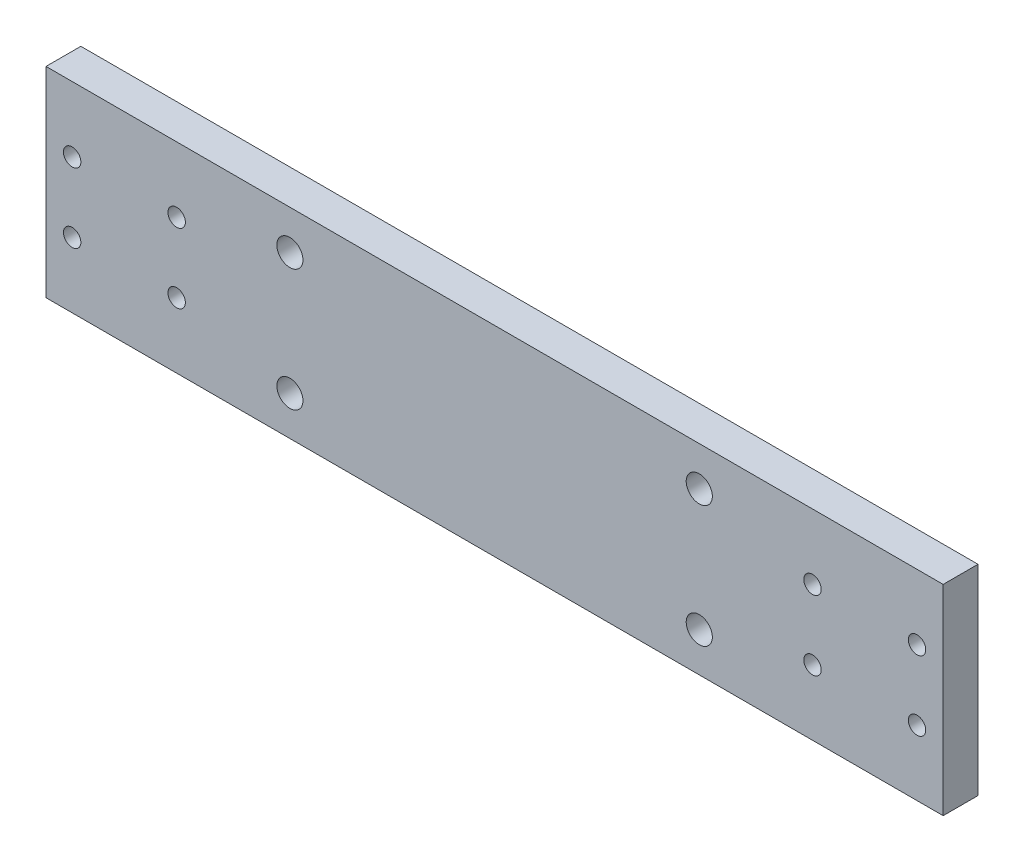
ISO-10303-21;
HEADER;
FILE_DESCRIPTION(('STEP AP214'),'2;1');
FILE_NAME('part.step','',(''),(''),'','','');
FILE_SCHEMA(('AUTOMOTIVE_DESIGN { 1 0 10303 214 1 1 1 1 }'));
ENDSEC;
DATA;
#1=APPLICATION_CONTEXT('core data for automotive mechanical design processes');
#2=APPLICATION_PROTOCOL_DEFINITION('international standard','automotive_design',2000,#1);
#3=PRODUCT_CONTEXT('',#1,'mechanical');
#4=PRODUCT('Part','Part','',(#3));
#5=PRODUCT_RELATED_PRODUCT_CATEGORY('part','',(#4));
#6=PRODUCT_DEFINITION_FORMATION('','',#4);
#7=PRODUCT_DEFINITION_CONTEXT('part definition',#1,'design');
#8=PRODUCT_DEFINITION('design','',#6,#7);
#9=PRODUCT_DEFINITION_SHAPE('','',#8);
#10=(LENGTH_UNIT() NAMED_UNIT(*) SI_UNIT(.MILLI.,.METRE.));
#11=(NAMED_UNIT(*) PLANE_ANGLE_UNIT() SI_UNIT($,.RADIAN.));
#12=(NAMED_UNIT(*) SI_UNIT($,.STERADIAN.) SOLID_ANGLE_UNIT());
#13=UNCERTAINTY_MEASURE_WITH_UNIT(LENGTH_MEASURE(1.E-05),#10,'distance_accuracy_value','');
#14=(GEOMETRIC_REPRESENTATION_CONTEXT(3) GLOBAL_UNCERTAINTY_ASSIGNED_CONTEXT((#13)) GLOBAL_UNIT_ASSIGNED_CONTEXT((#10,
#11,#12)) REPRESENTATION_CONTEXT('',''));
#15=CARTESIAN_POINT('',(0.,0.,0.));
#16=DIRECTION('',(0.,0.,1.));
#17=DIRECTION('',(1.,0.,0.));
#18=AXIS2_PLACEMENT_3D('',#15,#16,#17);
#19=CARTESIAN_POINT('',(0.,-11.5,4.));
#20=DIRECTION('',(0.,1.,0.));
#21=DIRECTION('',(0.,0.,1.));
#22=AXIS2_PLACEMENT_3D('',#19,#20,#21);
#23=PLANE('',#22);
#24=DIRECTION('',(1.,0.,0.));
#25=VECTOR('',#24,1.);
#26=CARTESIAN_POINT('',(0.,-11.5,0.));
#27=LINE('',#26,#25);
#28=CARTESIAN_POINT('',(-51.5,-11.5,0.));
#29=VERTEX_POINT('',#28);
#30=CARTESIAN_POINT('',(51.5,-11.5,0.));
#31=VERTEX_POINT('',#30);
#32=EDGE_CURVE('E138',#29,#31,#27,.T.);
#33=ORIENTED_EDGE('',*,*,#32,.T.);
#34=DIRECTION('',(0.,0.,-1.));
#35=VECTOR('',#34,1.);
#36=CARTESIAN_POINT('',(51.5,-11.5,4.));
#37=LINE('',#36,#35);
#38=CARTESIAN_POINT('',(51.5,-11.5,4.));
#39=VERTEX_POINT('',#38);
#40=EDGE_CURVE('E11',#39,#31,#37,.T.);
#41=ORIENTED_EDGE('',*,*,#40,.F.);
#42=DIRECTION('',(1.,0.,0.));
#43=VECTOR('',#42,1.);
#44=CARTESIAN_POINT('',(0.,-11.5,4.));
#45=LINE('',#44,#43);
#46=CARTESIAN_POINT('',(-51.5,-11.5,4.));
#47=VERTEX_POINT('',#46);
#48=EDGE_CURVE('E88',#47,#39,#45,.T.);
#49=ORIENTED_EDGE('',*,*,#48,.F.);
#50=DIRECTION('',(0.,0.,-1.));
#51=VECTOR('',#50,1.);
#52=CARTESIAN_POINT('',(-51.5,-11.5,4.));
#53=LINE('',#52,#51);
#54=EDGE_CURVE('E55',#47,#29,#53,.T.);
#55=ORIENTED_EDGE('',*,*,#54,.T.);
#56=EDGE_LOOP('',(#33,#41,#49,#55));
#57=FACE_BOUND('',#56,.T.);
#58=ADVANCED_FACE('F38',(#57),#23,.F.);
#59=CARTESIAN_POINT('',(51.5,0.,4.));
#60=DIRECTION('',(-1.,0.,0.));
#61=DIRECTION('',(0.,0.,1.));
#62=AXIS2_PLACEMENT_3D('',#59,#60,#61);
#63=PLANE('',#62);
#64=DIRECTION('',(0.,1.,0.));
#65=VECTOR('',#64,1.);
#66=CARTESIAN_POINT('',(51.5,0.,0.));
#67=LINE('',#66,#65);
#68=CARTESIAN_POINT('',(51.5,11.5,0.));
#69=VERTEX_POINT('',#68);
#70=EDGE_CURVE('E93',#31,#69,#67,.T.);
#71=ORIENTED_EDGE('',*,*,#70,.T.);
#72=DIRECTION('',(0.,0.,-1.));
#73=VECTOR('',#72,1.);
#74=CARTESIAN_POINT('',(51.5,11.5,4.));
#75=LINE('',#74,#73);
#76=CARTESIAN_POINT('',(51.5,11.5,4.));
#77=VERTEX_POINT('',#76);
#78=EDGE_CURVE('E47',#77,#69,#75,.T.);
#79=ORIENTED_EDGE('',*,*,#78,.F.);
#80=DIRECTION('',(0.,1.,0.));
#81=VECTOR('',#80,1.);
#82=CARTESIAN_POINT('',(51.5,0.,4.));
#83=LINE('',#82,#81);
#84=EDGE_CURVE('E80',#39,#77,#83,.T.);
#85=ORIENTED_EDGE('',*,*,#84,.F.);
#86=ORIENTED_EDGE('',*,*,#40,.T.);
#87=EDGE_LOOP('',(#71,#79,#85,#86));
#88=FACE_BOUND('',#87,.T.);
#89=ADVANCED_FACE('F92',(#88),#63,.F.);
#90=CARTESIAN_POINT('',(0.,11.5,4.));
#91=DIRECTION('',(0.,1.,0.));
#92=DIRECTION('',(0.,0.,1.));
#93=AXIS2_PLACEMENT_3D('',#90,#91,#92);
#94=PLANE('',#93);
#95=DIRECTION('',(1.,0.,0.));
#96=VECTOR('',#95,1.);
#97=CARTESIAN_POINT('',(0.,11.5,0.));
#98=LINE('',#97,#96);
#99=CARTESIAN_POINT('',(-51.5,11.5,0.));
#100=VERTEX_POINT('',#99);
#101=EDGE_CURVE('E141',#100,#69,#98,.T.);
#102=ORIENTED_EDGE('',*,*,#101,.F.);
#103=DIRECTION('',(0.,0.,-1.));
#104=VECTOR('',#103,1.);
#105=CARTESIAN_POINT('',(-51.5,11.5,4.));
#106=LINE('',#105,#104);
#107=CARTESIAN_POINT('',(-51.5,11.5,4.));
#108=VERTEX_POINT('',#107);
#109=EDGE_CURVE('E69',#108,#100,#106,.T.);
#110=ORIENTED_EDGE('',*,*,#109,.F.);
#111=DIRECTION('',(1.,0.,0.));
#112=VECTOR('',#111,1.);
#113=CARTESIAN_POINT('',(0.,11.5,4.));
#114=LINE('',#113,#112);
#115=EDGE_CURVE('E87',#108,#77,#114,.T.);
#116=ORIENTED_EDGE('',*,*,#115,.T.);
#117=ORIENTED_EDGE('',*,*,#78,.T.);
#118=EDGE_LOOP('',(#102,#110,#116,#117));
#119=FACE_BOUND('',#118,.T.);
#120=ADVANCED_FACE('F96',(#119),#94,.T.);
#121=CARTESIAN_POINT('',(-23.5,-7.,4.));
#122=DIRECTION('',(0.,0.,-1.));
#123=DIRECTION('',(-1.,0.,0.));
#124=AXIS2_PLACEMENT_3D('',#121,#122,#123);
#125=CYLINDRICAL_SURFACE('',#124,1.5);
#126=CARTESIAN_POINT('',(-23.5,-7.,4.));
#127=DIRECTION('',(0.,0.,1.));
#128=DIRECTION('',(1.,0.,0.));
#129=AXIS2_PLACEMENT_3D('',#126,#127,#128);
#130=CIRCLE('',#129,1.5);
#131=CARTESIAN_POINT('',(-22.,-7.,4.));
#132=VERTEX_POINT('',#131);
#133=EDGE_CURVE('E184',#132,#132,#130,.T.);
#134=ORIENTED_EDGE('',*,*,#133,.T.);
#135=EDGE_LOOP('',(#134));
#136=FACE_BOUND('',#135,.T.);
#137=CARTESIAN_POINT('',(-23.5,-7.,0.));
#138=DIRECTION('',(0.,0.,1.));
#139=DIRECTION('',(1.,0.,0.));
#140=AXIS2_PLACEMENT_3D('',#137,#138,#139);
#141=CIRCLE('',#140,1.5);
#142=CARTESIAN_POINT('',(-22.,-7.,0.));
#143=VERTEX_POINT('',#142);
#144=EDGE_CURVE('E135',#143,#143,#141,.T.);
#145=ORIENTED_EDGE('',*,*,#144,.F.);
#146=EDGE_LOOP('',(#145));
#147=FACE_BOUND('',#146,.T.);
#148=ADVANCED_FACE('F188',(#136,#147),#125,.F.);
#149=CARTESIAN_POINT('',(-48.5,4.,4.));
#150=DIRECTION('',(0.,0.,-1.));
#151=DIRECTION('',(-1.,0.,0.));
#152=AXIS2_PLACEMENT_3D('',#149,#150,#151);
#153=CYLINDRICAL_SURFACE('',#152,0.999999999999998);
#154=CARTESIAN_POINT('',(-48.5,4.,4.));
#155=DIRECTION('',(0.,0.,1.));
#156=DIRECTION('',(1.,0.,0.));
#157=AXIS2_PLACEMENT_3D('',#154,#155,#156);
#158=CIRCLE('',#157,0.999999999999998);
#159=CARTESIAN_POINT('',(-47.5,4.,4.));
#160=VERTEX_POINT('',#159);
#161=EDGE_CURVE('E181',#160,#160,#158,.T.);
#162=ORIENTED_EDGE('',*,*,#161,.T.);
#163=EDGE_LOOP('',(#162));
#164=FACE_BOUND('',#163,.T.);
#165=CARTESIAN_POINT('',(-48.5,4.,0.));
#166=DIRECTION('',(0.,0.,1.));
#167=DIRECTION('',(1.,0.,0.));
#168=AXIS2_PLACEMENT_3D('',#165,#166,#167);
#169=CIRCLE('',#168,0.999999999999998);
#170=CARTESIAN_POINT('',(-47.5,4.,0.));
#171=VERTEX_POINT('',#170);
#172=EDGE_CURVE('E132',#171,#171,#169,.T.);
#173=ORIENTED_EDGE('',*,*,#172,.F.);
#174=EDGE_LOOP('',(#173));
#175=FACE_BOUND('',#174,.T.);
#176=ADVANCED_FACE('F214',(#164,#175),#153,.F.);
#177=CARTESIAN_POINT('',(36.5,4.,4.));
#178=DIRECTION('',(0.,0.,-1.));
#179=DIRECTION('',(-1.,0.,0.));
#180=AXIS2_PLACEMENT_3D('',#177,#178,#179);
#181=CYLINDRICAL_SURFACE('',#180,0.999999999999998);
#182=CARTESIAN_POINT('',(36.5,4.,4.));
#183=DIRECTION('',(0.,0.,1.));
#184=DIRECTION('',(1.,0.,0.));
#185=AXIS2_PLACEMENT_3D('',#182,#183,#184);
#186=CIRCLE('',#185,0.999999999999998);
#187=CARTESIAN_POINT('',(37.5,4.,4.));
#188=VERTEX_POINT('',#187);
#189=EDGE_CURVE('E178',#188,#188,#186,.T.);
#190=ORIENTED_EDGE('',*,*,#189,.T.);
#191=EDGE_LOOP('',(#190));
#192=FACE_BOUND('',#191,.T.);
#193=CARTESIAN_POINT('',(36.5,4.,0.));
#194=DIRECTION('',(0.,0.,1.));
#195=DIRECTION('',(1.,0.,0.));
#196=AXIS2_PLACEMENT_3D('',#193,#194,#195);
#197=CIRCLE('',#196,0.999999999999998);
#198=CARTESIAN_POINT('',(37.5,4.,0.));
#199=VERTEX_POINT('',#198);
#200=EDGE_CURVE('E129',#199,#199,#197,.T.);
#201=ORIENTED_EDGE('',*,*,#200,.F.);
#202=EDGE_LOOP('',(#201));
#203=FACE_BOUND('',#202,.T.);
#204=ADVANCED_FACE('F217',(#192,#203),#181,.F.);
#205=CARTESIAN_POINT('',(23.5,7.,4.));
#206=DIRECTION('',(0.,0.,-1.));
#207=DIRECTION('',(-1.,0.,0.));
#208=AXIS2_PLACEMENT_3D('',#205,#206,#207);
#209=CYLINDRICAL_SURFACE('',#208,1.5);
#210=CARTESIAN_POINT('',(23.5,7.,4.));
#211=DIRECTION('',(0.,0.,1.));
#212=DIRECTION('',(1.,0.,0.));
#213=AXIS2_PLACEMENT_3D('',#210,#211,#212);
#214=CIRCLE('',#213,1.5);
#215=CARTESIAN_POINT('',(25.,7.,4.));
#216=VERTEX_POINT('',#215);
#217=EDGE_CURVE('E175',#216,#216,#214,.T.);
#218=ORIENTED_EDGE('',*,*,#217,.T.);
#219=EDGE_LOOP('',(#218));
#220=FACE_BOUND('',#219,.T.);
#221=CARTESIAN_POINT('',(23.5,7.,0.));
#222=DIRECTION('',(0.,0.,1.));
#223=DIRECTION('',(1.,0.,0.));
#224=AXIS2_PLACEMENT_3D('',#221,#222,#223);
#225=CIRCLE('',#224,1.5);
#226=CARTESIAN_POINT('',(25.,7.,0.));
#227=VERTEX_POINT('',#226);
#228=EDGE_CURVE('E126',#227,#227,#225,.T.);
#229=ORIENTED_EDGE('',*,*,#228,.F.);
#230=EDGE_LOOP('',(#229));
#231=FACE_BOUND('',#230,.T.);
#232=ADVANCED_FACE('F221',(#220,#231),#209,.F.);
#233=CARTESIAN_POINT('',(-23.5,7.,4.));
#234=DIRECTION('',(0.,0.,-1.));
#235=DIRECTION('',(-1.,0.,0.));
#236=AXIS2_PLACEMENT_3D('',#233,#234,#235);
#237=CYLINDRICAL_SURFACE('',#236,1.5);
#238=CARTESIAN_POINT('',(-23.5,7.,4.));
#239=DIRECTION('',(0.,0.,1.));
#240=DIRECTION('',(1.,0.,0.));
#241=AXIS2_PLACEMENT_3D('',#238,#239,#240);
#242=CIRCLE('',#241,1.5);
#243=CARTESIAN_POINT('',(-22.,7.,4.));
#244=VERTEX_POINT('',#243);
#245=EDGE_CURVE('E172',#244,#244,#242,.T.);
#246=ORIENTED_EDGE('',*,*,#245,.T.);
#247=EDGE_LOOP('',(#246));
#248=FACE_BOUND('',#247,.T.);
#249=CARTESIAN_POINT('',(-23.5,7.,0.));
#250=DIRECTION('',(0.,0.,1.));
#251=DIRECTION('',(1.,0.,0.));
#252=AXIS2_PLACEMENT_3D('',#249,#250,#251);
#253=CIRCLE('',#252,1.5);
#254=CARTESIAN_POINT('',(-22.,7.,0.));
#255=VERTEX_POINT('',#254);
#256=EDGE_CURVE('E123',#255,#255,#253,.T.);
#257=ORIENTED_EDGE('',*,*,#256,.F.);
#258=EDGE_LOOP('',(#257));
#259=FACE_BOUND('',#258,.T.);
#260=ADVANCED_FACE('F225',(#248,#259),#237,.F.);
#261=CARTESIAN_POINT('',(23.5,-7.,4.));
#262=DIRECTION('',(0.,0.,-1.));
#263=DIRECTION('',(-1.,0.,0.));
#264=AXIS2_PLACEMENT_3D('',#261,#262,#263);
#265=CYLINDRICAL_SURFACE('',#264,1.5);
#266=CARTESIAN_POINT('',(23.5,-7.,4.));
#267=DIRECTION('',(0.,0.,1.));
#268=DIRECTION('',(1.,0.,0.));
#269=AXIS2_PLACEMENT_3D('',#266,#267,#268);
#270=CIRCLE('',#269,1.5);
#271=CARTESIAN_POINT('',(25.,-7.,4.));
#272=VERTEX_POINT('',#271);
#273=EDGE_CURVE('E169',#272,#272,#270,.T.);
#274=ORIENTED_EDGE('',*,*,#273,.T.);
#275=EDGE_LOOP('',(#274));
#276=FACE_BOUND('',#275,.T.);
#277=CARTESIAN_POINT('',(23.5,-7.,0.));
#278=DIRECTION('',(0.,0.,1.));
#279=DIRECTION('',(1.,0.,0.));
#280=AXIS2_PLACEMENT_3D('',#277,#278,#279);
#281=CIRCLE('',#280,1.5);
#282=CARTESIAN_POINT('',(25.,-7.,0.));
#283=VERTEX_POINT('',#282);
#284=EDGE_CURVE('E120',#283,#283,#281,.T.);
#285=ORIENTED_EDGE('',*,*,#284,.F.);
#286=EDGE_LOOP('',(#285));
#287=FACE_BOUND('',#286,.T.);
#288=ADVANCED_FACE('F229',(#276,#287),#265,.F.);
#289=CARTESIAN_POINT('',(-36.5,-4.,4.));
#290=DIRECTION('',(0.,0.,-1.));
#291=DIRECTION('',(-1.,0.,0.));
#292=AXIS2_PLACEMENT_3D('',#289,#290,#291);
#293=CYLINDRICAL_SURFACE('',#292,0.999999999999998);
#294=CARTESIAN_POINT('',(-36.5,-4.,4.));
#295=DIRECTION('',(0.,0.,1.));
#296=DIRECTION('',(1.,0.,0.));
#297=AXIS2_PLACEMENT_3D('',#294,#295,#296);
#298=CIRCLE('',#297,0.999999999999998);
#299=CARTESIAN_POINT('',(-35.5,-4.,4.));
#300=VERTEX_POINT('',#299);
#301=EDGE_CURVE('E166',#300,#300,#298,.T.);
#302=ORIENTED_EDGE('',*,*,#301,.T.);
#303=EDGE_LOOP('',(#302));
#304=FACE_BOUND('',#303,.T.);
#305=CARTESIAN_POINT('',(-36.5,-4.,0.));
#306=DIRECTION('',(0.,0.,1.));
#307=DIRECTION('',(1.,0.,0.));
#308=AXIS2_PLACEMENT_3D('',#305,#306,#307);
#309=CIRCLE('',#308,0.999999999999998);
#310=CARTESIAN_POINT('',(-35.5,-4.,0.));
#311=VERTEX_POINT('',#310);
#312=EDGE_CURVE('E117',#311,#311,#309,.T.);
#313=ORIENTED_EDGE('',*,*,#312,.F.);
#314=EDGE_LOOP('',(#313));
#315=FACE_BOUND('',#314,.T.);
#316=ADVANCED_FACE('F233',(#304,#315),#293,.F.);
#317=CARTESIAN_POINT('',(-36.5,4.,4.));
#318=DIRECTION('',(0.,0.,-1.));
#319=DIRECTION('',(-1.,0.,0.));
#320=AXIS2_PLACEMENT_3D('',#317,#318,#319);
#321=CYLINDRICAL_SURFACE('',#320,0.999999999999998);
#322=CARTESIAN_POINT('',(-36.5,4.,4.));
#323=DIRECTION('',(0.,0.,1.));
#324=DIRECTION('',(1.,0.,0.));
#325=AXIS2_PLACEMENT_3D('',#322,#323,#324);
#326=CIRCLE('',#325,0.999999999999998);
#327=CARTESIAN_POINT('',(-35.5,4.,4.));
#328=VERTEX_POINT('',#327);
#329=EDGE_CURVE('E163',#328,#328,#326,.T.);
#330=ORIENTED_EDGE('',*,*,#329,.T.);
#331=EDGE_LOOP('',(#330));
#332=FACE_BOUND('',#331,.T.);
#333=CARTESIAN_POINT('',(-36.5,4.,0.));
#334=DIRECTION('',(0.,0.,1.));
#335=DIRECTION('',(1.,0.,0.));
#336=AXIS2_PLACEMENT_3D('',#333,#334,#335);
#337=CIRCLE('',#336,0.999999999999998);
#338=CARTESIAN_POINT('',(-35.5,4.,0.));
#339=VERTEX_POINT('',#338);
#340=EDGE_CURVE('E114',#339,#339,#337,.T.);
#341=ORIENTED_EDGE('',*,*,#340,.F.);
#342=EDGE_LOOP('',(#341));
#343=FACE_BOUND('',#342,.T.);
#344=ADVANCED_FACE('F237',(#332,#343),#321,.F.);
#345=CARTESIAN_POINT('',(-48.5,-4.,4.));
#346=DIRECTION('',(0.,0.,-1.));
#347=DIRECTION('',(-1.,0.,0.));
#348=AXIS2_PLACEMENT_3D('',#345,#346,#347);
#349=CYLINDRICAL_SURFACE('',#348,0.999999999999998);
#350=CARTESIAN_POINT('',(-48.5,-4.,4.));
#351=DIRECTION('',(0.,0.,1.));
#352=DIRECTION('',(1.,0.,0.));
#353=AXIS2_PLACEMENT_3D('',#350,#351,#352);
#354=CIRCLE('',#353,0.999999999999998);
#355=CARTESIAN_POINT('',(-47.5,-4.,4.));
#356=VERTEX_POINT('',#355);
#357=EDGE_CURVE('E160',#356,#356,#354,.T.);
#358=ORIENTED_EDGE('',*,*,#357,.T.);
#359=EDGE_LOOP('',(#358));
#360=FACE_BOUND('',#359,.T.);
#361=CARTESIAN_POINT('',(-48.5,-4.,0.));
#362=DIRECTION('',(0.,0.,1.));
#363=DIRECTION('',(1.,0.,0.));
#364=AXIS2_PLACEMENT_3D('',#361,#362,#363);
#365=CIRCLE('',#364,0.999999999999998);
#366=CARTESIAN_POINT('',(-47.5,-4.,0.));
#367=VERTEX_POINT('',#366);
#368=EDGE_CURVE('E111',#367,#367,#365,.T.);
#369=ORIENTED_EDGE('',*,*,#368,.F.);
#370=EDGE_LOOP('',(#369));
#371=FACE_BOUND('',#370,.T.);
#372=ADVANCED_FACE('F241',(#360,#371),#349,.F.);
#373=CARTESIAN_POINT('',(48.5,-4.,4.));
#374=DIRECTION('',(0.,0.,-1.));
#375=DIRECTION('',(-1.,0.,0.));
#376=AXIS2_PLACEMENT_3D('',#373,#374,#375);
#377=CYLINDRICAL_SURFACE('',#376,0.999999999999998);
#378=CARTESIAN_POINT('',(48.5,-4.,4.));
#379=DIRECTION('',(0.,0.,1.));
#380=DIRECTION('',(1.,0.,0.));
#381=AXIS2_PLACEMENT_3D('',#378,#379,#380);
#382=CIRCLE('',#381,0.999999999999998);
#383=CARTESIAN_POINT('',(49.5,-4.,4.));
#384=VERTEX_POINT('',#383);
#385=EDGE_CURVE('E155',#384,#384,#382,.T.);
#386=ORIENTED_EDGE('',*,*,#385,.T.);
#387=EDGE_LOOP('',(#386));
#388=FACE_BOUND('',#387,.T.);
#389=CARTESIAN_POINT('',(48.5,-4.,0.));
#390=DIRECTION('',(0.,0.,1.));
#391=DIRECTION('',(1.,0.,0.));
#392=AXIS2_PLACEMENT_3D('',#389,#390,#391);
#393=CIRCLE('',#392,0.999999999999998);
#394=CARTESIAN_POINT('',(49.5,-4.,0.));
#395=VERTEX_POINT('',#394);
#396=EDGE_CURVE('E108',#395,#395,#393,.T.);
#397=ORIENTED_EDGE('',*,*,#396,.F.);
#398=EDGE_LOOP('',(#397));
#399=FACE_BOUND('',#398,.T.);
#400=ADVANCED_FACE('F245',(#388,#399),#377,.F.);
#401=CARTESIAN_POINT('',(48.5,4.,4.));
#402=DIRECTION('',(0.,0.,-1.));
#403=DIRECTION('',(-1.,0.,0.));
#404=AXIS2_PLACEMENT_3D('',#401,#402,#403);
#405=CYLINDRICAL_SURFACE('',#404,0.999999999999998);
#406=CARTESIAN_POINT('',(48.5,4.,4.));
#407=DIRECTION('',(0.,0.,1.));
#408=DIRECTION('',(1.,0.,0.));
#409=AXIS2_PLACEMENT_3D('',#406,#407,#408);
#410=CIRCLE('',#409,0.999999999999998);
#411=CARTESIAN_POINT('',(49.5,4.,4.));
#412=VERTEX_POINT('',#411);
#413=EDGE_CURVE('E150',#412,#412,#410,.T.);
#414=ORIENTED_EDGE('',*,*,#413,.T.);
#415=EDGE_LOOP('',(#414));
#416=FACE_BOUND('',#415,.T.);
#417=CARTESIAN_POINT('',(48.5,4.,0.));
#418=DIRECTION('',(0.,0.,1.));
#419=DIRECTION('',(1.,0.,0.));
#420=AXIS2_PLACEMENT_3D('',#417,#418,#419);
#421=CIRCLE('',#420,0.999999999999998);
#422=CARTESIAN_POINT('',(49.5,4.,0.));
#423=VERTEX_POINT('',#422);
#424=EDGE_CURVE('E105',#423,#423,#421,.T.);
#425=ORIENTED_EDGE('',*,*,#424,.F.);
#426=EDGE_LOOP('',(#425));
#427=FACE_BOUND('',#426,.T.);
#428=ADVANCED_FACE('F248',(#416,#427),#405,.F.);
#429=CARTESIAN_POINT('',(36.5,-4.,4.));
#430=DIRECTION('',(0.,0.,-1.));
#431=DIRECTION('',(-1.,0.,0.));
#432=AXIS2_PLACEMENT_3D('',#429,#430,#431);
#433=CYLINDRICAL_SURFACE('',#432,0.999999999999998);
#434=CARTESIAN_POINT('',(36.5,-4.,4.));
#435=DIRECTION('',(0.,0.,1.));
#436=DIRECTION('',(1.,0.,0.));
#437=AXIS2_PLACEMENT_3D('',#434,#435,#436);
#438=CIRCLE('',#437,0.999999999999998);
#439=CARTESIAN_POINT('',(37.5,-4.,4.));
#440=VERTEX_POINT('',#439);
#441=EDGE_CURVE('E146',#440,#440,#438,.T.);
#442=ORIENTED_EDGE('',*,*,#441,.T.);
#443=EDGE_LOOP('',(#442));
#444=FACE_BOUND('',#443,.T.);
#445=CARTESIAN_POINT('',(36.5,-4.,0.));
#446=DIRECTION('',(0.,0.,1.));
#447=DIRECTION('',(1.,0.,0.));
#448=AXIS2_PLACEMENT_3D('',#445,#446,#447);
#449=CIRCLE('',#448,0.999999999999998);
#450=CARTESIAN_POINT('',(37.5,-4.,0.));
#451=VERTEX_POINT('',#450);
#452=EDGE_CURVE('E102',#451,#451,#449,.T.);
#453=ORIENTED_EDGE('',*,*,#452,.F.);
#454=EDGE_LOOP('',(#453));
#455=FACE_BOUND('',#454,.T.);
#456=ADVANCED_FACE('F40',(#444,#455),#433,.F.);
#457=CARTESIAN_POINT('',(-51.5,0.,4.));
#458=DIRECTION('',(-1.,0.,0.));
#459=DIRECTION('',(0.,0.,1.));
#460=AXIS2_PLACEMENT_3D('',#457,#458,#459);
#461=PLANE('',#460);
#462=DIRECTION('',(0.,1.,0.));
#463=VECTOR('',#462,1.);
#464=CARTESIAN_POINT('',(-51.5,0.,0.));
#465=LINE('',#464,#463);
#466=EDGE_CURVE('E143',#29,#100,#465,.T.);
#467=ORIENTED_EDGE('',*,*,#466,.F.);
#468=ORIENTED_EDGE('',*,*,#54,.F.);
#469=DIRECTION('',(0.,1.,0.));
#470=VECTOR('',#469,1.);
#471=CARTESIAN_POINT('',(-51.5,0.,4.));
#472=LINE('',#471,#470);
#473=EDGE_CURVE('E97',#47,#108,#472,.T.);
#474=ORIENTED_EDGE('',*,*,#473,.T.);
#475=ORIENTED_EDGE('',*,*,#109,.T.);
#476=EDGE_LOOP('',(#467,#468,#474,#475));
#477=FACE_BOUND('',#476,.T.);
#478=ADVANCED_FACE('F193',(#477),#461,.T.);
#479=CARTESIAN_POINT('',(0.,0.,4.));
#480=DIRECTION('',(0.,0.,1.));
#481=DIRECTION('',(1.,0.,0.));
#482=AXIS2_PLACEMENT_3D('',#479,#480,#481);
#483=PLANE('',#482);
#484=ORIENTED_EDGE('',*,*,#441,.F.);
#485=EDGE_LOOP('',(#484));
#486=FACE_BOUND('',#485,.T.);
#487=ORIENTED_EDGE('',*,*,#413,.F.);
#488=EDGE_LOOP('',(#487));
#489=FACE_BOUND('',#488,.T.);
#490=ORIENTED_EDGE('',*,*,#385,.F.);
#491=EDGE_LOOP('',(#490));
#492=FACE_BOUND('',#491,.T.);
#493=ORIENTED_EDGE('',*,*,#357,.F.);
#494=EDGE_LOOP('',(#493));
#495=FACE_BOUND('',#494,.T.);
#496=ORIENTED_EDGE('',*,*,#329,.F.);
#497=EDGE_LOOP('',(#496));
#498=FACE_BOUND('',#497,.T.);
#499=ORIENTED_EDGE('',*,*,#301,.F.);
#500=EDGE_LOOP('',(#499));
#501=FACE_BOUND('',#500,.T.);
#502=ORIENTED_EDGE('',*,*,#273,.F.);
#503=EDGE_LOOP('',(#502));
#504=FACE_BOUND('',#503,.T.);
#505=ORIENTED_EDGE('',*,*,#245,.F.);
#506=EDGE_LOOP('',(#505));
#507=FACE_BOUND('',#506,.T.);
#508=ORIENTED_EDGE('',*,*,#217,.F.);
#509=EDGE_LOOP('',(#508));
#510=FACE_BOUND('',#509,.T.);
#511=ORIENTED_EDGE('',*,*,#189,.F.);
#512=EDGE_LOOP('',(#511));
#513=FACE_BOUND('',#512,.T.);
#514=ORIENTED_EDGE('',*,*,#161,.F.);
#515=EDGE_LOOP('',(#514));
#516=FACE_BOUND('',#515,.T.);
#517=ORIENTED_EDGE('',*,*,#133,.F.);
#518=EDGE_LOOP('',(#517));
#519=FACE_BOUND('',#518,.T.);
#520=ORIENTED_EDGE('',*,*,#48,.T.);
#521=ORIENTED_EDGE('',*,*,#84,.T.);
#522=ORIENTED_EDGE('',*,*,#115,.F.);
#523=ORIENTED_EDGE('',*,*,#473,.F.);
#524=EDGE_LOOP('',(#520,#521,#522,#523));
#525=FACE_BOUND('',#524,.T.);
#526=ADVANCED_FACE('F84',(#486,#489,#492,#495,#498,#501,#504,#507,#510,#513,#516,#519,#525),
#483,.T.);
#527=CARTESIAN_POINT('',(0.,0.,0.));
#528=DIRECTION('',(0.,0.,1.));
#529=DIRECTION('',(1.,0.,0.));
#530=AXIS2_PLACEMENT_3D('',#527,#528,#529);
#531=PLANE('',#530);
#532=ORIENTED_EDGE('',*,*,#452,.T.);
#533=EDGE_LOOP('',(#532));
#534=FACE_BOUND('',#533,.T.);
#535=ORIENTED_EDGE('',*,*,#424,.T.);
#536=EDGE_LOOP('',(#535));
#537=FACE_BOUND('',#536,.T.);
#538=ORIENTED_EDGE('',*,*,#396,.T.);
#539=EDGE_LOOP('',(#538));
#540=FACE_BOUND('',#539,.T.);
#541=ORIENTED_EDGE('',*,*,#368,.T.);
#542=EDGE_LOOP('',(#541));
#543=FACE_BOUND('',#542,.T.);
#544=ORIENTED_EDGE('',*,*,#340,.T.);
#545=EDGE_LOOP('',(#544));
#546=FACE_BOUND('',#545,.T.);
#547=ORIENTED_EDGE('',*,*,#312,.T.);
#548=EDGE_LOOP('',(#547));
#549=FACE_BOUND('',#548,.T.);
#550=ORIENTED_EDGE('',*,*,#284,.T.);
#551=EDGE_LOOP('',(#550));
#552=FACE_BOUND('',#551,.T.);
#553=ORIENTED_EDGE('',*,*,#256,.T.);
#554=EDGE_LOOP('',(#553));
#555=FACE_BOUND('',#554,.T.);
#556=ORIENTED_EDGE('',*,*,#228,.T.);
#557=EDGE_LOOP('',(#556));
#558=FACE_BOUND('',#557,.T.);
#559=ORIENTED_EDGE('',*,*,#200,.T.);
#560=EDGE_LOOP('',(#559));
#561=FACE_BOUND('',#560,.T.);
#562=ORIENTED_EDGE('',*,*,#172,.T.);
#563=EDGE_LOOP('',(#562));
#564=FACE_BOUND('',#563,.T.);
#565=ORIENTED_EDGE('',*,*,#144,.T.);
#566=EDGE_LOOP('',(#565));
#567=FACE_BOUND('',#566,.T.);
#568=ORIENTED_EDGE('',*,*,#32,.F.);
#569=ORIENTED_EDGE('',*,*,#466,.T.);
#570=ORIENTED_EDGE('',*,*,#101,.T.);
#571=ORIENTED_EDGE('',*,*,#70,.F.);
#572=EDGE_LOOP('',(#568,#569,#570,#571));
#573=FACE_BOUND('',#572,.T.);
#574=ADVANCED_FACE('F192',(#534,#537,#540,#543,#546,#549,#552,#555,#558,#561,#564,#567,#573),
#531,.F.);
#575=CLOSED_SHELL('',(#58,#89,#120,#148,#176,#204,#232,#260,#288,#316,#344,#372,#400,#428,#456,
#478,#526,#574));
#576=MANIFOLD_SOLID_BREP('B2',#575);
#577=ADVANCED_BREP_SHAPE_REPRESENTATION('',(#18,#576),#14);
#578=SHAPE_DEFINITION_REPRESENTATION(#9,#577);
ENDSEC;
END-ISO-10303-21;
